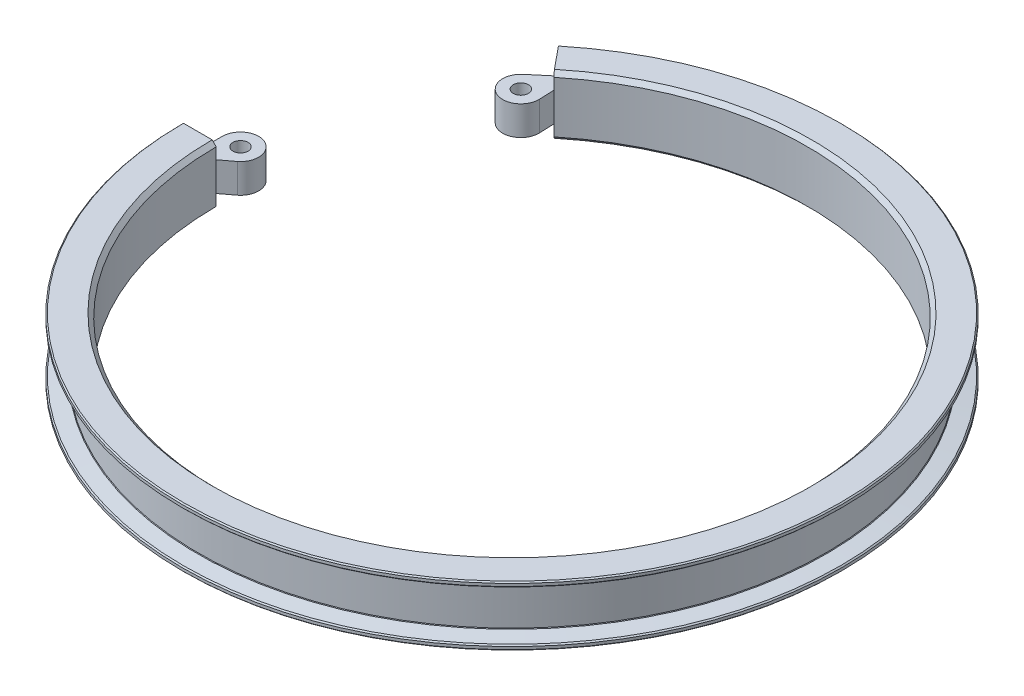
ISO-10303-21;
HEADER;
FILE_DESCRIPTION(('STEP AP214'),'2;1');
FILE_NAME('part.step','',(''),(''),'','','');
FILE_SCHEMA(('AUTOMOTIVE_DESIGN { 1 0 10303 214 1 1 1 1 }'));
ENDSEC;
DATA;
#1=APPLICATION_CONTEXT('core data for automotive mechanical design processes');
#2=APPLICATION_PROTOCOL_DEFINITION('international standard','automotive_design',2000,#1);
#3=PRODUCT_CONTEXT('',#1,'mechanical');
#4=PRODUCT('Part','Part','',(#3));
#5=PRODUCT_RELATED_PRODUCT_CATEGORY('part','',(#4));
#6=PRODUCT_DEFINITION_FORMATION('','',#4);
#7=PRODUCT_DEFINITION_CONTEXT('part definition',#1,'design');
#8=PRODUCT_DEFINITION('design','',#6,#7);
#9=PRODUCT_DEFINITION_SHAPE('','',#8);
#10=(LENGTH_UNIT() NAMED_UNIT(*) SI_UNIT(.MILLI.,.METRE.));
#11=(NAMED_UNIT(*) PLANE_ANGLE_UNIT() SI_UNIT($,.RADIAN.));
#12=(NAMED_UNIT(*) SI_UNIT($,.STERADIAN.) SOLID_ANGLE_UNIT());
#13=UNCERTAINTY_MEASURE_WITH_UNIT(LENGTH_MEASURE(1.E-05),#10,'distance_accuracy_value','');
#14=(GEOMETRIC_REPRESENTATION_CONTEXT(3) GLOBAL_UNCERTAINTY_ASSIGNED_CONTEXT((#13)) GLOBAL_UNIT_ASSIGNED_CONTEXT((#10,
#11,#12)) REPRESENTATION_CONTEXT('',''));
#15=CARTESIAN_POINT('',(0.,0.,0.));
#16=DIRECTION('',(0.,0.,1.));
#17=DIRECTION('',(1.,0.,0.));
#18=AXIS2_PLACEMENT_3D('',#15,#16,#17);
#19=CARTESIAN_POINT('',(0.,0.,0.));
#20=DIRECTION('',(0.,-1.,0.));
#21=DIRECTION('',(0.,0.,-1.));
#22=AXIS2_PLACEMENT_3D('',#19,#20,#21);
#23=CYLINDRICAL_SURFACE('',#22,64.262);
#24=CARTESIAN_POINT('',(0.,-3.175,0.));
#25=DIRECTION('',(0.,1.,0.));
#26=DIRECTION('',(0.,0.,1.));
#27=AXIS2_PLACEMENT_3D('',#24,#25,#26);
#28=CIRCLE('',#27,64.262);
#29=CARTESIAN_POINT('',(-40.667594664767,-3.175,-49.7569230176286));
#30=VERTEX_POINT('',#29);
#31=CARTESIAN_POINT('',(-40.6635868408749,-3.175,-49.760198444486));
#32=VERTEX_POINT('',#31);
#33=EDGE_CURVE('E237',#30,#32,#28,.F.);
#34=ORIENTED_EDGE('',*,*,#33,.F.);
#35=DIRECTION('',(0.,1.,0.));
#36=VECTOR('',#35,1.);
#37=CARTESIAN_POINT('',(-40.667594664767,5.60346378382917,-49.7569230176286));
#38=LINE('',#37,#36);
#39=CARTESIAN_POINT('',(-40.667594664767,-5.6034637838292,-49.7569230176286));
#40=VERTEX_POINT('',#39);
#41=EDGE_CURVE('E355',#40,#30,#38,.T.);
#42=ORIENTED_EDGE('',*,*,#41,.F.);
#43=CARTESIAN_POINT('',(0.,-5.6034637838292,0.));
#44=DIRECTION('',(0.,-1.,0.));
#45=DIRECTION('',(0.,0.,-1.));
#46=AXIS2_PLACEMENT_3D('',#43,#44,#45);
#47=CIRCLE('',#46,64.262);
#48=CARTESIAN_POINT('',(-64.262,-5.6034637838292,0.));
#49=VERTEX_POINT('',#48);
#50=EDGE_CURVE('E391',#40,#49,#47,.T.);
#51=ORIENTED_EDGE('',*,*,#50,.T.);
#52=DIRECTION('',(0.,1.,0.));
#53=VECTOR('',#52,1.);
#54=CARTESIAN_POINT('',(-64.262,5.60346378382917,0.));
#55=LINE('',#54,#53);
#56=CARTESIAN_POINT('',(-64.262,-3.175,0.));
#57=VERTEX_POINT('',#56);
#58=EDGE_CURVE('E306',#49,#57,#55,.T.);
#59=ORIENTED_EDGE('',*,*,#58,.T.);
#60=DIRECTION('',(0.,1.,0.));
#61=VECTOR('',#60,1.);
#62=CARTESIAN_POINT('',(-64.262,-3.175,0.));
#63=LINE('',#62,#61);
#64=CARTESIAN_POINT('',(-64.262,3.175,0.));
#65=VERTEX_POINT('',#64);
#66=EDGE_CURVE('E268',#57,#65,#63,.T.);
#67=ORIENTED_EDGE('',*,*,#66,.T.);
#68=CARTESIAN_POINT('',(-64.262,5.60346378382917,0.));
#69=VERTEX_POINT('',#68);
#70=EDGE_CURVE('E305',#65,#69,#55,.T.);
#71=ORIENTED_EDGE('',*,*,#70,.T.);
#72=CARTESIAN_POINT('',(0.,5.60346378382917,0.));
#73=DIRECTION('',(0.,-1.,0.));
#74=DIRECTION('',(0.,0.,-1.));
#75=AXIS2_PLACEMENT_3D('',#72,#73,#74);
#76=CIRCLE('',#75,64.262);
#77=CARTESIAN_POINT('',(-40.667594664767,5.60346378382917,-49.7569230176286));
#78=VERTEX_POINT('',#77);
#79=EDGE_CURVE('E388',#78,#69,#76,.T.);
#80=ORIENTED_EDGE('',*,*,#79,.F.);
#81=CARTESIAN_POINT('',(-40.667594664767,3.175,-49.7569230176286));
#82=VERTEX_POINT('',#81);
#83=EDGE_CURVE('E354',#82,#78,#38,.T.);
#84=ORIENTED_EDGE('',*,*,#83,.F.);
#85=CARTESIAN_POINT('',(0.,3.175,0.));
#86=DIRECTION('',(0.,1.,0.));
#87=DIRECTION('',(0.,0.,1.));
#88=AXIS2_PLACEMENT_3D('',#85,#86,#87);
#89=CIRCLE('',#88,64.262);
#90=CARTESIAN_POINT('',(-40.6635868408749,3.175,-49.760198444486));
#91=VERTEX_POINT('',#90);
#92=EDGE_CURVE('E52',#82,#91,#89,.F.);
#93=ORIENTED_EDGE('',*,*,#92,.T.);
#94=DIRECTION('',(0.,1.,0.));
#95=VECTOR('',#94,1.);
#96=CARTESIAN_POINT('',(-40.6635868408749,-3.175,-49.760198444486));
#97=LINE('',#96,#95);
#98=EDGE_CURVE('E47',#32,#91,#97,.T.);
#99=ORIENTED_EDGE('',*,*,#98,.F.);
#100=EDGE_LOOP('',(#34,#42,#51,#59,#67,#71,#80,#84,#93,#99));
#101=FACE_BOUND('',#100,.T.);
#102=ADVANCED_FACE('F32',(#101),#23,.F.);
#103=CARTESIAN_POINT('',(-43.2294649636545,4.60035370374329,-52.8913789473109));
#104=DIRECTION('',(-0.774282204376281,0.,0.632840475938611));
#105=DIRECTION('',(0.632840475938611,0.,0.774282204376281));
#106=AXIS2_PLACEMENT_3D('',#103,#104,#105);
#107=PLANE('',#106);
#108=ORIENTED_EDGE('',*,*,#41,.T.);
#109=DIRECTION('',(-0.632840475938611,0.,-0.774282204376281));
#110=VECTOR('',#109,1.);
#111=CARTESIAN_POINT('',(-43.2294649636545,-3.175,-52.8913789473109));
#112=LINE('',#111,#110);
#113=CARTESIAN_POINT('',(-43.0786661012368,-3.175,-52.7068760906674));
#114=VERTEX_POINT('',#113);
#115=EDGE_CURVE('E11',#30,#114,#112,.T.);
#116=ORIENTED_EDGE('',*,*,#115,.T.);
#117=DIRECTION('',(0.,-1.,0.));
#118=VECTOR('',#117,1.);
#119=CARTESIAN_POINT('',(-43.0786661012368,4.60035370374329,-52.7068760906674));
#120=LINE('',#119,#118);
#121=CARTESIAN_POINT('',(-43.0786661012368,3.175,-52.7068760906674));
#122=VERTEX_POINT('',#121);
#123=EDGE_CURVE('E40',#122,#114,#120,.T.);
#124=ORIENTED_EDGE('',*,*,#123,.F.);
#125=DIRECTION('',(-0.632840475938611,0.,-0.774282204376281));
#126=VECTOR('',#125,1.);
#127=CARTESIAN_POINT('',(-43.2294649636545,3.175,-52.8913789473109));
#128=LINE('',#127,#126);
#129=EDGE_CURVE('E410',#82,#122,#128,.T.);
#130=ORIENTED_EDGE('',*,*,#129,.F.);
#131=ORIENTED_EDGE('',*,*,#83,.T.);
#132=DIRECTION('',(-0.447485791945515,0.707106781186546,-0.547500197266538));
#133=VECTOR('',#132,1.);
#134=CARTESIAN_POINT('',(-41.2268272535047,6.48715028935531,-50.4411457531049));
#135=LINE('',#134,#133);
#136=CARTESIAN_POINT('',(-41.2268272535047,6.48715028935531,-50.4411457531049));
#137=VERTEX_POINT('',#136);
#138=EDGE_CURVE('E358',#78,#137,#135,.T.);
#139=ORIENTED_EDGE('',*,*,#138,.T.);
#140=DIRECTION('',(-0.632840475938611,0.,-0.774282204376281));
#141=VECTOR('',#140,1.);
#142=CARTESIAN_POINT('',(-45.1683561296424,6.48715028935531,-55.2636180551527));
#143=LINE('',#142,#141);
#144=CARTESIAN_POINT('',(-45.1683561296424,6.48715028935531,-55.2636180551527));
#145=VERTEX_POINT('',#144);
#146=EDGE_CURVE('E361',#137,#145,#143,.T.);
#147=ORIENTED_EDGE('',*,*,#146,.T.);
#148=DIRECTION('',(-0.447485791945518,-0.707106781186541,-0.547500197266541));
#149=VECTOR('',#148,1.);
#150=CARTESIAN_POINT('',(-45.3290976105308,6.23315028935531,-55.4602857350642));
#151=LINE('',#150,#149);
#152=CARTESIAN_POINT('',(-45.3290976105308,6.23315028935531,-55.4602857350642));
#153=VERTEX_POINT('',#152);
#154=EDGE_CURVE('E364',#145,#153,#151,.T.);
#155=ORIENTED_EDGE('',*,*,#154,.T.);
#156=DIRECTION('',(0.,-1.,0.));
#157=VECTOR('',#156,1.);
#158=CARTESIAN_POINT('',(-45.3290976105308,5.64222278957888,-55.4602857350642));
#159=LINE('',#158,#157);
#160=CARTESIAN_POINT('',(-45.3290976105308,5.64222278957888,-55.4602857350642));
#161=VERTEX_POINT('',#160);
#162=EDGE_CURVE('E367',#153,#161,#159,.T.);
#163=ORIENTED_EDGE('',*,*,#162,.T.);
#164=DIRECTION('',(0.447485791945518,-0.707106781186541,0.547500197266541));
#165=VECTOR('',#164,1.);
#166=CARTESIAN_POINT('',(-45.1683561296424,5.38822278957888,-55.2636180551527));
#167=LINE('',#166,#165);
#168=CARTESIAN_POINT('',(-45.1683561296424,5.38822278957888,-55.2636180551527));
#169=VERTEX_POINT('',#168);
#170=EDGE_CURVE('E370',#161,#169,#167,.T.);
#171=ORIENTED_EDGE('',*,*,#170,.T.);
#172=DIRECTION('',(0.623226207124281,-0.173648177666921,0.762519117889146));
#173=VECTOR('',#172,1.);
#174=CARTESIAN_POINT('',(-43.1505291566454,4.82599999999999,-52.7948007526804));
#175=LINE('',#174,#173);
#176=CARTESIAN_POINT('',(-43.1505291566454,4.82599999999999,-52.7948007526804));
#177=VERTEX_POINT('',#176);
#178=EDGE_CURVE('E373',#169,#177,#175,.T.);
#179=ORIENTED_EDGE('',*,*,#178,.T.);
#180=CARTESIAN_POINT('',(-43.2294649636545,4.60035370374329,-52.8913789473109));
#181=DIRECTION('',(0.774282204376281,0.,-0.632840475938611));
#182=DIRECTION('',(0.632840475938611,0.,0.774282204376281));
#183=AXIS2_PLACEMENT_3D('',#180,#181,#182);
#184=CIRCLE('',#183,0.257826415094774);
#185=CARTESIAN_POINT('',(-43.0787168780931,4.69899999999998,-52.7069382163022));
#186=VERTEX_POINT('',#185);
#187=EDGE_CURVE('E327',#177,#186,#184,.T.);
#188=ORIENTED_EDGE('',*,*,#187,.T.);
#189=DIRECTION('',(0.,-1.,0.));
#190=VECTOR('',#189,1.);
#191=CARTESIAN_POINT('',(-43.0787168780931,4.69899999999998,-52.7069382163022));
#192=LINE('',#191,#190);
#193=CARTESIAN_POINT('',(-43.0787168780931,-4.69900000000002,-52.7069382163022));
#194=VERTEX_POINT('',#193);
#195=EDGE_CURVE('E330',#186,#194,#192,.T.);
#196=ORIENTED_EDGE('',*,*,#195,.T.);
#197=CARTESIAN_POINT('',(-43.2294649636545,-4.6003537037433,-52.8913789473108));
#198=DIRECTION('',(0.774282204376281,0.,-0.632840475938611));
#199=DIRECTION('',(-0.632840475938611,0.,-0.774282204376281));
#200=AXIS2_PLACEMENT_3D('',#197,#198,#199);
#201=CIRCLE('',#200,0.257826415094761);
#202=CARTESIAN_POINT('',(-43.1505291566454,-4.82599999999999,-52.7948007526804));
#203=VERTEX_POINT('',#202);
#204=EDGE_CURVE('E333',#194,#203,#201,.T.);
#205=ORIENTED_EDGE('',*,*,#204,.T.);
#206=DIRECTION('',(-0.62322620712428,-0.173648177666924,-0.762519117889145));
#207=VECTOR('',#206,1.);
#208=CARTESIAN_POINT('',(-43.1505291566454,-4.82599999999999,-52.7948007526804));
#209=LINE('',#208,#207);
#210=CARTESIAN_POINT('',(-45.1683561296424,-5.38822278957889,-55.2636180551527));
#211=VERTEX_POINT('',#210);
#212=EDGE_CURVE('E336',#203,#211,#209,.T.);
#213=ORIENTED_EDGE('',*,*,#212,.T.);
#214=DIRECTION('',(-0.44748579194551,-0.707106781186554,-0.547500197266532));
#215=VECTOR('',#214,1.);
#216=CARTESIAN_POINT('',(-45.1683561296424,-5.38822278957889,-55.2636180551527));
#217=LINE('',#216,#215);
#218=CARTESIAN_POINT('',(-45.3290976105308,-5.64222278957891,-55.4602857350642));
#219=VERTEX_POINT('',#218);
#220=EDGE_CURVE('E339',#211,#219,#217,.T.);
#221=ORIENTED_EDGE('',*,*,#220,.T.);
#222=DIRECTION('',(0.,-1.,0.));
#223=VECTOR('',#222,1.);
#224=CARTESIAN_POINT('',(-45.3290976105308,-5.64222278957891,-55.4602857350642));
#225=LINE('',#224,#223);
#226=CARTESIAN_POINT('',(-45.3290976105308,-6.23315028935535,-55.4602857350642));
#227=VERTEX_POINT('',#226);
#228=EDGE_CURVE('E342',#219,#227,#225,.T.);
#229=ORIENTED_EDGE('',*,*,#228,.T.);
#230=DIRECTION('',(0.447485791945516,-0.707106781186544,0.547500197266539));
#231=VECTOR('',#230,1.);
#232=CARTESIAN_POINT('',(-45.3290976105308,-6.23315028935535,-55.4602857350642));
#233=LINE('',#232,#231);
#234=CARTESIAN_POINT('',(-45.1683561296424,-6.48715028935535,-55.2636180551527));
#235=VERTEX_POINT('',#234);
#236=EDGE_CURVE('E345',#227,#235,#233,.T.);
#237=ORIENTED_EDGE('',*,*,#236,.T.);
#238=DIRECTION('',(0.632840475938611,0.,0.774282204376281));
#239=VECTOR('',#238,1.);
#240=CARTESIAN_POINT('',(-45.1683561296424,-6.48715028935535,-55.2636180551527));
#241=LINE('',#240,#239);
#242=CARTESIAN_POINT('',(-41.2268272535047,-6.48715028935535,-50.4411457531049));
#243=VERTEX_POINT('',#242);
#244=EDGE_CURVE('E348',#235,#243,#241,.T.);
#245=ORIENTED_EDGE('',*,*,#244,.T.);
#246=DIRECTION('',(0.447485791945514,0.707106781186547,0.547500197266537));
#247=VECTOR('',#246,1.);
#248=CARTESIAN_POINT('',(-41.2268272535047,-6.48715028935535,-50.4411457531049));
#249=LINE('',#248,#247);
#250=EDGE_CURVE('E351',#243,#40,#249,.T.);
#251=ORIENTED_EDGE('',*,*,#250,.T.);
#252=EDGE_LOOP('',(#108,#116,#124,#130,#131,#139,#147,#155,#163,#171,#179,#188,#196,#205,#213,
#221,#229,#237,#245,#251));
#253=FACE_BOUND('',#252,.T.);
#254=ADVANCED_FACE('F420',(#253),#107,.T.);
#255=CARTESIAN_POINT('',(-68.3102086659957,4.60035370374329,0.));
#256=DIRECTION('',(0.,0.,1.));
#257=DIRECTION('',(1.,0.,0.));
#258=AXIS2_PLACEMENT_3D('',#255,#256,#257);
#259=PLANE('',#258);
#260=DIRECTION('',(1.,0.,0.));
#261=VECTOR('',#260,1.);
#262=CARTESIAN_POINT('',(-64.262,3.175,0.));
#263=LINE('',#262,#261);
#264=CARTESIAN_POINT('',(-68.072,3.175,0.));
#265=VERTEX_POINT('',#264);
#266=EDGE_CURVE('E242',#265,#65,#263,.T.);
#267=ORIENTED_EDGE('',*,*,#266,.F.);
#268=DIRECTION('',(0.,-1.,0.));
#269=VECTOR('',#268,1.);
#270=CARTESIAN_POINT('',(-68.072,4.69899999999998,0.));
#271=LINE('',#270,#269);
#272=CARTESIAN_POINT('',(-68.072,4.69899999999998,0.));
#273=VERTEX_POINT('',#272);
#274=EDGE_CURVE('E281',#273,#265,#271,.T.);
#275=ORIENTED_EDGE('',*,*,#274,.F.);
#276=CARTESIAN_POINT('',(-68.3102086659957,4.60035370374329,0.));
#277=DIRECTION('',(0.,0.,-1.));
#278=DIRECTION('',(1.,0.,0.));
#279=AXIS2_PLACEMENT_3D('',#276,#277,#278);
#280=CIRCLE('',#279,0.257826415094774);
#281=CARTESIAN_POINT('',(-68.1854761148863,4.82599999999999,0.));
#282=VERTEX_POINT('',#281);
#283=EDGE_CURVE('E272',#282,#273,#280,.T.);
#284=ORIENTED_EDGE('',*,*,#283,.F.);
#285=DIRECTION('',(0.98480775301221,-0.173648177666921,0.));
#286=VECTOR('',#285,1.);
#287=CARTESIAN_POINT('',(-68.1854761148863,4.82599999999999,0.));
#288=LINE('',#287,#286);
#289=CARTESIAN_POINT('',(-71.374,5.38822278957888,0.));
#290=VERTEX_POINT('',#289);
#291=EDGE_CURVE('E324',#290,#282,#288,.T.);
#292=ORIENTED_EDGE('',*,*,#291,.F.);
#293=DIRECTION('',(0.707106781186554,-0.707106781186541,0.));
#294=VECTOR('',#293,1.);
#295=CARTESIAN_POINT('',(-71.374,5.38822278957888,0.));
#296=LINE('',#295,#294);
#297=CARTESIAN_POINT('',(-71.628,5.64222278957888,0.));
#298=VERTEX_POINT('',#297);
#299=EDGE_CURVE('E321',#298,#290,#296,.T.);
#300=ORIENTED_EDGE('',*,*,#299,.F.);
#301=DIRECTION('',(0.,-1.,0.));
#302=VECTOR('',#301,1.);
#303=CARTESIAN_POINT('',(-71.628,5.64222278957888,0.));
#304=LINE('',#303,#302);
#305=CARTESIAN_POINT('',(-71.628,6.23315028935531,0.));
#306=VERTEX_POINT('',#305);
#307=EDGE_CURVE('E318',#306,#298,#304,.T.);
#308=ORIENTED_EDGE('',*,*,#307,.F.);
#309=DIRECTION('',(-0.707106781186554,-0.707106781186541,0.));
#310=VECTOR('',#309,1.);
#311=CARTESIAN_POINT('',(-71.628,6.23315028935531,0.));
#312=LINE('',#311,#310);
#313=CARTESIAN_POINT('',(-71.374,6.48715028935531,0.));
#314=VERTEX_POINT('',#313);
#315=EDGE_CURVE('E315',#314,#306,#312,.T.);
#316=ORIENTED_EDGE('',*,*,#315,.F.);
#317=DIRECTION('',(-1.,0.,0.));
#318=VECTOR('',#317,1.);
#319=CARTESIAN_POINT('',(-71.374,6.48715028935531,0.));
#320=LINE('',#319,#318);
#321=CARTESIAN_POINT('',(-65.1456865055261,6.48715028935531,0.));
#322=VERTEX_POINT('',#321);
#323=EDGE_CURVE('E312',#322,#314,#320,.T.);
#324=ORIENTED_EDGE('',*,*,#323,.F.);
#325=DIRECTION('',(-0.707106781186549,0.707106781186546,0.));
#326=VECTOR('',#325,1.);
#327=CARTESIAN_POINT('',(-65.1456865055261,6.48715028935531,0.));
#328=LINE('',#327,#326);
#329=EDGE_CURVE('E309',#69,#322,#328,.T.);
#330=ORIENTED_EDGE('',*,*,#329,.F.);
#331=ORIENTED_EDGE('',*,*,#70,.F.);
#332=EDGE_LOOP('',(#267,#275,#284,#292,#300,#308,#316,#324,#330,#331));
#333=FACE_BOUND('',#332,.T.);
#334=ADVANCED_FACE('F448',(#333),#259,.F.);
#335=CARTESIAN_POINT('',(0.,4.60035370374329,0.));
#336=DIRECTION('',(0.,-1.,0.));
#337=DIRECTION('',(0.,0.,-1.));
#338=AXIS2_PLACEMENT_3D('',#335,#336,#337);
#339=TOROIDAL_SURFACE('',#338,68.3102086659957,0.257826415094774);
#340=CARTESIAN_POINT('',(0.,4.69899999999998,0.));
#341=DIRECTION('',(0.,-1.,0.));
#342=DIRECTION('',(0.,0.,-1.));
#343=AXIS2_PLACEMENT_3D('',#340,#341,#342);
#344=CIRCLE('',#343,68.072);
#345=EDGE_CURVE('E408',#186,#273,#344,.T.);
#346=ORIENTED_EDGE('',*,*,#345,.F.);
#347=ORIENTED_EDGE('',*,*,#187,.F.);
#348=CARTESIAN_POINT('',(0.,4.82599999999999,0.));
#349=DIRECTION('',(0.,-1.,0.));
#350=DIRECTION('',(0.,0.,-1.));
#351=AXIS2_PLACEMENT_3D('',#348,#349,#350);
#352=CIRCLE('',#351,68.1854761148863);
#353=EDGE_CURVE('E376',#177,#282,#352,.T.);
#354=ORIENTED_EDGE('',*,*,#353,.T.);
#355=ORIENTED_EDGE('',*,*,#283,.T.);
#356=EDGE_LOOP('',(#346,#347,#354,#355));
#357=FACE_BOUND('',#356,.T.);
#358=ADVANCED_FACE('F504',(#357),#339,.F.);
#359=CARTESIAN_POINT('',(0.,0.,0.));
#360=DIRECTION('',(0.,-1.,0.));
#361=DIRECTION('',(0.,0.,-1.));
#362=AXIS2_PLACEMENT_3D('',#359,#360,#361);
#363=CYLINDRICAL_SURFACE('',#362,68.072);
#364=CARTESIAN_POINT('',(0.,-4.69900000000002,0.));
#365=DIRECTION('',(0.,-1.,0.));
#366=DIRECTION('',(0.,0.,-1.));
#367=AXIS2_PLACEMENT_3D('',#364,#365,#366);
#368=CIRCLE('',#367,68.072);
#369=CARTESIAN_POINT('',(-68.072,-4.69900000000002,0.));
#370=VERTEX_POINT('',#369);
#371=EDGE_CURVE('E405',#194,#370,#368,.T.);
#372=ORIENTED_EDGE('',*,*,#371,.F.);
#373=ORIENTED_EDGE('',*,*,#195,.F.);
#374=ORIENTED_EDGE('',*,*,#345,.T.);
#375=ORIENTED_EDGE('',*,*,#274,.T.);
#376=DIRECTION('',(0.,1.,0.));
#377=VECTOR('',#376,1.);
#378=CARTESIAN_POINT('',(-68.072,-3.175,0.));
#379=LINE('',#378,#377);
#380=CARTESIAN_POINT('',(-68.072,-3.175,0.));
#381=VERTEX_POINT('',#380);
#382=EDGE_CURVE('E269',#381,#265,#379,.T.);
#383=ORIENTED_EDGE('',*,*,#382,.F.);
#384=EDGE_CURVE('E280',#381,#370,#271,.T.);
#385=ORIENTED_EDGE('',*,*,#384,.T.);
#386=EDGE_LOOP('',(#372,#373,#374,#375,#383,#385));
#387=FACE_BOUND('',#386,.T.);
#388=ADVANCED_FACE('F34',(#387),#363,.T.);
#389=CARTESIAN_POINT('',(0.,-4.6003537037433,0.));
#390=DIRECTION('',(0.,-1.,0.));
#391=DIRECTION('',(0.,0.,-1.));
#392=AXIS2_PLACEMENT_3D('',#389,#390,#391);
#393=TOROIDAL_SURFACE('',#392,68.3102086659957,0.257826415094761);
#394=CARTESIAN_POINT('',(0.,-4.82599999999999,0.));
#395=DIRECTION('',(0.,-1.,0.));
#396=DIRECTION('',(0.,0.,-1.));
#397=AXIS2_PLACEMENT_3D('',#394,#395,#396);
#398=CIRCLE('',#397,68.1854761148863);
#399=CARTESIAN_POINT('',(-68.1854761148863,-4.82599999999999,0.));
#400=VERTEX_POINT('',#399);
#401=EDGE_CURVE('E403',#203,#400,#398,.T.);
#402=ORIENTED_EDGE('',*,*,#401,.F.);
#403=ORIENTED_EDGE('',*,*,#204,.F.);
#404=ORIENTED_EDGE('',*,*,#371,.T.);
#405=CARTESIAN_POINT('',(-68.3102086659957,-4.6003537037433,0.));
#406=DIRECTION('',(0.,0.,-1.));
#407=DIRECTION('',(-1.,0.,0.));
#408=AXIS2_PLACEMENT_3D('',#405,#406,#407);
#409=CIRCLE('',#408,0.257826415094761);
#410=EDGE_CURVE('E284',#370,#400,#409,.T.);
#411=ORIENTED_EDGE('',*,*,#410,.T.);
#412=EDGE_LOOP('',(#402,#403,#404,#411));
#413=FACE_BOUND('',#412,.T.);
#414=ADVANCED_FACE('F497',(#413),#393,.F.);
#415=CARTESIAN_POINT('',(0.,-4.82599999999999,0.));
#416=DIRECTION('',(0.,-1.,0.));
#417=DIRECTION('',(0.,0.,-1.));
#418=AXIS2_PLACEMENT_3D('',#415,#416,#417);
#419=CONICAL_SURFACE('',#418,68.1854761148863,1.39626340159547);
#420=CARTESIAN_POINT('',(0.,-5.38822278957889,0.));
#421=DIRECTION('',(0.,-1.,0.));
#422=DIRECTION('',(0.,0.,-1.));
#423=AXIS2_PLACEMENT_3D('',#420,#421,#422);
#424=CIRCLE('',#423,71.374);
#425=CARTESIAN_POINT('',(-71.374,-5.38822278957889,0.));
#426=VERTEX_POINT('',#425);
#427=EDGE_CURVE('E401',#211,#426,#424,.T.);
#428=ORIENTED_EDGE('',*,*,#427,.F.);
#429=ORIENTED_EDGE('',*,*,#212,.F.);
#430=ORIENTED_EDGE('',*,*,#401,.T.);
#431=DIRECTION('',(-0.984807753012209,-0.173648177666924,0.));
#432=VECTOR('',#431,1.);
#433=CARTESIAN_POINT('',(-68.1854761148863,-4.82599999999999,0.));
#434=LINE('',#433,#432);
#435=EDGE_CURVE('E287',#400,#426,#434,.T.);
#436=ORIENTED_EDGE('',*,*,#435,.T.);
#437=EDGE_LOOP('',(#428,#429,#430,#436));
#438=FACE_BOUND('',#437,.T.);
#439=ADVANCED_FACE('F494',(#438),#419,.T.);
#440=CARTESIAN_POINT('',(0.,-5.38822278957889,0.));
#441=DIRECTION('',(0.,-1.,0.));
#442=DIRECTION('',(0.,0.,-1.));
#443=AXIS2_PLACEMENT_3D('',#440,#441,#442);
#444=CONICAL_SURFACE('',#443,71.374,0.78539816339744);
#445=CARTESIAN_POINT('',(0.,-5.64222278957891,0.));
#446=DIRECTION('',(0.,-1.,0.));
#447=DIRECTION('',(0.,0.,-1.));
#448=AXIS2_PLACEMENT_3D('',#445,#446,#447);
#449=CIRCLE('',#448,71.628);
#450=CARTESIAN_POINT('',(-71.628,-5.64222278957891,0.));
#451=VERTEX_POINT('',#450);
#452=EDGE_CURVE('E399',#219,#451,#449,.T.);
#453=ORIENTED_EDGE('',*,*,#452,.F.);
#454=ORIENTED_EDGE('',*,*,#220,.F.);
#455=ORIENTED_EDGE('',*,*,#427,.T.);
#456=DIRECTION('',(-0.707106781186541,-0.707106781186554,0.));
#457=VECTOR('',#456,1.);
#458=CARTESIAN_POINT('',(-71.374,-5.38822278957889,0.));
#459=LINE('',#458,#457);
#460=EDGE_CURVE('E290',#426,#451,#459,.T.);
#461=ORIENTED_EDGE('',*,*,#460,.T.);
#462=EDGE_LOOP('',(#453,#454,#455,#461));
#463=FACE_BOUND('',#462,.T.);
#464=ADVANCED_FACE('F490',(#463),#444,.T.);
#465=CARTESIAN_POINT('',(0.,0.,0.));
#466=DIRECTION('',(0.,-1.,0.));
#467=DIRECTION('',(0.,0.,-1.));
#468=AXIS2_PLACEMENT_3D('',#465,#466,#467);
#469=CYLINDRICAL_SURFACE('',#468,71.628);
#470=CARTESIAN_POINT('',(0.,-6.23315028935535,0.));
#471=DIRECTION('',(0.,-1.,0.));
#472=DIRECTION('',(0.,0.,-1.));
#473=AXIS2_PLACEMENT_3D('',#470,#471,#472);
#474=CIRCLE('',#473,71.628);
#475=CARTESIAN_POINT('',(-71.628,-6.23315028935535,0.));
#476=VERTEX_POINT('',#475);
#477=EDGE_CURVE('E397',#227,#476,#474,.T.);
#478=ORIENTED_EDGE('',*,*,#477,.F.);
#479=ORIENTED_EDGE('',*,*,#228,.F.);
#480=ORIENTED_EDGE('',*,*,#452,.T.);
#481=DIRECTION('',(0.,-1.,0.));
#482=VECTOR('',#481,1.);
#483=CARTESIAN_POINT('',(-71.628,-5.64222278957891,0.));
#484=LINE('',#483,#482);
#485=EDGE_CURVE('E293',#451,#476,#484,.T.);
#486=ORIENTED_EDGE('',*,*,#485,.T.);
#487=EDGE_LOOP('',(#478,#479,#480,#486));
#488=FACE_BOUND('',#487,.T.);
#489=ADVANCED_FACE('F486',(#488),#469,.T.);
#490=CARTESIAN_POINT('',(0.,-6.23315028935535,0.));
#491=DIRECTION('',(0.,1.,0.));
#492=DIRECTION('',(0.,0.,1.));
#493=AXIS2_PLACEMENT_3D('',#490,#491,#492);
#494=CONICAL_SURFACE('',#493,71.628,0.785398163397453);
#495=CARTESIAN_POINT('',(0.,-6.48715028935535,0.));
#496=DIRECTION('',(0.,-1.,0.));
#497=DIRECTION('',(0.,0.,-1.));
#498=AXIS2_PLACEMENT_3D('',#495,#496,#497);
#499=CIRCLE('',#498,71.374);
#500=CARTESIAN_POINT('',(-71.374,-6.48715028935535,0.));
#501=VERTEX_POINT('',#500);
#502=EDGE_CURVE('E395',#235,#501,#499,.T.);
#503=ORIENTED_EDGE('',*,*,#502,.F.);
#504=ORIENTED_EDGE('',*,*,#236,.F.);
#505=ORIENTED_EDGE('',*,*,#477,.T.);
#506=DIRECTION('',(0.707106781186551,-0.707106781186544,0.));
#507=VECTOR('',#506,1.);
#508=CARTESIAN_POINT('',(-71.628,-6.23315028935535,0.));
#509=LINE('',#508,#507);
#510=EDGE_CURVE('E296',#476,#501,#509,.T.);
#511=ORIENTED_EDGE('',*,*,#510,.T.);
#512=EDGE_LOOP('',(#503,#504,#505,#511));
#513=FACE_BOUND('',#512,.T.);
#514=ADVANCED_FACE('F482',(#513),#494,.T.);
#515=CARTESIAN_POINT('',(-45.1683561296424,-6.48715028935535,-55.2636180551527));
#516=DIRECTION('',(0.,1.,0.));
#517=DIRECTION('',(0.,0.,1.));
#518=AXIS2_PLACEMENT_3D('',#515,#516,#517);
#519=PLANE('',#518);
#520=CARTESIAN_POINT('',(0.,-6.48715028935535,0.));
#521=DIRECTION('',(0.,-1.,0.));
#522=DIRECTION('',(0.,0.,-1.));
#523=AXIS2_PLACEMENT_3D('',#520,#521,#522);
#524=CIRCLE('',#523,65.1456865055261);
#525=CARTESIAN_POINT('',(-65.1456865055261,-6.48715028935535,0.));
#526=VERTEX_POINT('',#525);
#527=EDGE_CURVE('E393',#243,#526,#524,.T.);
#528=ORIENTED_EDGE('',*,*,#527,.F.);
#529=ORIENTED_EDGE('',*,*,#244,.F.);
#530=ORIENTED_EDGE('',*,*,#502,.T.);
#531=DIRECTION('',(1.,0.,0.));
#532=VECTOR('',#531,1.);
#533=CARTESIAN_POINT('',(-71.374,-6.48715028935535,0.));
#534=LINE('',#533,#532);
#535=EDGE_CURVE('E299',#501,#526,#534,.T.);
#536=ORIENTED_EDGE('',*,*,#535,.T.);
#537=EDGE_LOOP('',(#528,#529,#530,#536));
#538=FACE_BOUND('',#537,.T.);
#539=ADVANCED_FACE('F479',(#538),#519,.F.);
#540=CARTESIAN_POINT('',(0.,-6.48715028935535,0.));
#541=DIRECTION('',(0.,-1.,0.));
#542=DIRECTION('',(0.,0.,-1.));
#543=AXIS2_PLACEMENT_3D('',#540,#541,#542);
#544=CONICAL_SURFACE('',#543,65.1456865055261,0.785398163397449);
#545=ORIENTED_EDGE('',*,*,#50,.F.);
#546=ORIENTED_EDGE('',*,*,#250,.F.);
#547=ORIENTED_EDGE('',*,*,#527,.T.);
#548=DIRECTION('',(0.707106781186548,0.707106781186547,0.));
#549=VECTOR('',#548,1.);
#550=CARTESIAN_POINT('',(-65.1456865055261,-6.48715028935535,0.));
#551=LINE('',#550,#549);
#552=EDGE_CURVE('E302',#526,#49,#551,.T.);
#553=ORIENTED_EDGE('',*,*,#552,.T.);
#554=EDGE_LOOP('',(#545,#546,#547,#553));
#555=FACE_BOUND('',#554,.T.);
#556=ADVANCED_FACE('F424',(#555),#544,.F.);
#557=CARTESIAN_POINT('',(0.,5.60346378382917,0.));
#558=DIRECTION('',(0.,1.,0.));
#559=DIRECTION('',(0.,0.,1.));
#560=AXIS2_PLACEMENT_3D('',#557,#558,#559);
#561=CONICAL_SURFACE('',#560,64.262,0.78539816339745);
#562=CARTESIAN_POINT('',(0.,6.48715028935531,0.));
#563=DIRECTION('',(0.,-1.,0.));
#564=DIRECTION('',(0.,0.,-1.));
#565=AXIS2_PLACEMENT_3D('',#562,#563,#564);
#566=CIRCLE('',#565,65.1456865055261);
#567=EDGE_CURVE('E386',#137,#322,#566,.T.);
#568=ORIENTED_EDGE('',*,*,#567,.F.);
#569=ORIENTED_EDGE('',*,*,#138,.F.);
#570=ORIENTED_EDGE('',*,*,#79,.T.);
#571=ORIENTED_EDGE('',*,*,#329,.T.);
#572=EDGE_LOOP('',(#568,#569,#570,#571));
#573=FACE_BOUND('',#572,.T.);
#574=ADVANCED_FACE('F475',(#573),#561,.F.);
#575=CARTESIAN_POINT('',(-45.1683561296424,6.48715028935531,-55.2636180551527));
#576=DIRECTION('',(0.,-1.,0.));
#577=DIRECTION('',(0.,0.,-1.));
#578=AXIS2_PLACEMENT_3D('',#575,#576,#577);
#579=PLANE('',#578);
#580=CARTESIAN_POINT('',(0.,6.48715028935531,0.));
#581=DIRECTION('',(0.,-1.,0.));
#582=DIRECTION('',(0.,0.,-1.));
#583=AXIS2_PLACEMENT_3D('',#580,#581,#582);
#584=CIRCLE('',#583,71.374);
#585=EDGE_CURVE('E384',#145,#314,#584,.T.);
#586=ORIENTED_EDGE('',*,*,#585,.F.);
#587=ORIENTED_EDGE('',*,*,#146,.F.);
#588=ORIENTED_EDGE('',*,*,#567,.T.);
#589=ORIENTED_EDGE('',*,*,#323,.T.);
#590=EDGE_LOOP('',(#586,#587,#588,#589));
#591=FACE_BOUND('',#590,.T.);
#592=ADVANCED_FACE('F536',(#591),#579,.F.);
#593=CARTESIAN_POINT('',(0.,6.48715028935531,0.));
#594=DIRECTION('',(0.,-1.,0.));
#595=DIRECTION('',(0.,0.,-1.));
#596=AXIS2_PLACEMENT_3D('',#593,#594,#595);
#597=CONICAL_SURFACE('',#596,71.374,0.785398163397457);
#598=CARTESIAN_POINT('',(0.,6.23315028935531,0.));
#599=DIRECTION('',(0.,-1.,0.));
#600=DIRECTION('',(0.,0.,-1.));
#601=AXIS2_PLACEMENT_3D('',#598,#599,#600);
#602=CIRCLE('',#601,71.628);
#603=EDGE_CURVE('E382',#153,#306,#602,.T.);
#604=ORIENTED_EDGE('',*,*,#603,.F.);
#605=ORIENTED_EDGE('',*,*,#154,.F.);
#606=ORIENTED_EDGE('',*,*,#585,.T.);
#607=ORIENTED_EDGE('',*,*,#315,.T.);
#608=EDGE_LOOP('',(#604,#605,#606,#607));
#609=FACE_BOUND('',#608,.T.);
#610=ADVANCED_FACE('F533',(#609),#597,.T.);
#611=CARTESIAN_POINT('',(0.,0.,0.));
#612=DIRECTION('',(0.,-1.,0.));
#613=DIRECTION('',(0.,0.,-1.));
#614=AXIS2_PLACEMENT_3D('',#611,#612,#613);
#615=CYLINDRICAL_SURFACE('',#614,71.628);
#616=CARTESIAN_POINT('',(0.,5.64222278957888,0.));
#617=DIRECTION('',(0.,-1.,0.));
#618=DIRECTION('',(0.,0.,-1.));
#619=AXIS2_PLACEMENT_3D('',#616,#617,#618);
#620=CIRCLE('',#619,71.628);
#621=EDGE_CURVE('E380',#161,#298,#620,.T.);
#622=ORIENTED_EDGE('',*,*,#621,.F.);
#623=ORIENTED_EDGE('',*,*,#162,.F.);
#624=ORIENTED_EDGE('',*,*,#603,.T.);
#625=ORIENTED_EDGE('',*,*,#307,.T.);
#626=EDGE_LOOP('',(#622,#623,#624,#625));
#627=FACE_BOUND('',#626,.T.);
#628=ADVANCED_FACE('F529',(#627),#615,.T.);
#629=CARTESIAN_POINT('',(0.,5.64222278957888,0.));
#630=DIRECTION('',(0.,1.,0.));
#631=DIRECTION('',(0.,0.,1.));
#632=AXIS2_PLACEMENT_3D('',#629,#630,#631);
#633=CONICAL_SURFACE('',#632,71.628,0.785398163397457);
#634=CARTESIAN_POINT('',(0.,5.38822278957888,0.));
#635=DIRECTION('',(0.,-1.,0.));
#636=DIRECTION('',(0.,0.,-1.));
#637=AXIS2_PLACEMENT_3D('',#634,#635,#636);
#638=CIRCLE('',#637,71.374);
#639=EDGE_CURVE('E378',#169,#290,#638,.T.);
#640=ORIENTED_EDGE('',*,*,#639,.F.);
#641=ORIENTED_EDGE('',*,*,#170,.F.);
#642=ORIENTED_EDGE('',*,*,#621,.T.);
#643=ORIENTED_EDGE('',*,*,#299,.T.);
#644=EDGE_LOOP('',(#640,#641,#642,#643));
#645=FACE_BOUND('',#644,.T.);
#646=ADVANCED_FACE('F524',(#645),#633,.T.);
#647=CARTESIAN_POINT('',(0.,5.38822278957888,0.));
#648=DIRECTION('',(0.,1.,0.));
#649=DIRECTION('',(0.,0.,1.));
#650=AXIS2_PLACEMENT_3D('',#647,#648,#649);
#651=CONICAL_SURFACE('',#650,71.374,1.39626340159547);
#652=ORIENTED_EDGE('',*,*,#178,.F.);
#653=ORIENTED_EDGE('',*,*,#639,.T.);
#654=ORIENTED_EDGE('',*,*,#291,.T.);
#655=ORIENTED_EDGE('',*,*,#353,.F.);
#656=EDGE_LOOP('',(#652,#653,#654,#655));
#657=FACE_BOUND('',#656,.T.);
#658=ADVANCED_FACE('F464',(#657),#651,.T.);
#659=ORIENTED_EDGE('',*,*,#384,.F.);
#660=DIRECTION('',(1.,0.,0.));
#661=VECTOR('',#660,1.);
#662=CARTESIAN_POINT('',(-64.262,-3.175,0.));
#663=LINE('',#662,#661);
#664=EDGE_CURVE('E257',#381,#57,#663,.T.);
#665=ORIENTED_EDGE('',*,*,#664,.T.);
#666=ORIENTED_EDGE('',*,*,#58,.F.);
#667=ORIENTED_EDGE('',*,*,#552,.F.);
#668=ORIENTED_EDGE('',*,*,#535,.F.);
#669=ORIENTED_EDGE('',*,*,#510,.F.);
#670=ORIENTED_EDGE('',*,*,#485,.F.);
#671=ORIENTED_EDGE('',*,*,#460,.F.);
#672=ORIENTED_EDGE('',*,*,#435,.F.);
#673=ORIENTED_EDGE('',*,*,#410,.F.);
#674=EDGE_LOOP('',(#659,#665,#666,#667,#668,#669,#670,#671,#672,#673));
#675=FACE_BOUND('',#674,.T.);
#676=ADVANCED_FACE('F457',(#675),#259,.F.);
#677=CARTESIAN_POINT('',(-68.072,-3.175,0.));
#678=DIRECTION('',(-0.99989235039756,0.,-0.0146726826600587));
#679=DIRECTION('',(-0.0146726826600587,0.,0.99989235039756));
#680=AXIS2_PLACEMENT_3D('',#677,#678,#679);
#681=PLANE('',#680);
#682=ORIENTED_EDGE('',*,*,#382,.T.);
#683=DIRECTION('',(-0.0146726826600587,0.,0.99989235039756));
#684=VECTOR('',#683,1.);
#685=CARTESIAN_POINT('',(-68.072,3.175,0.));
#686=LINE('',#685,#684);
#687=CARTESIAN_POINT('',(-67.9978172906738,3.175,-5.05529392991885));
#688=VERTEX_POINT('',#687);
#689=EDGE_CURVE('E251',#688,#265,#686,.T.);
#690=ORIENTED_EDGE('',*,*,#689,.F.);
#691=DIRECTION('',(0.,1.,0.));
#692=VECTOR('',#691,1.);
#693=CARTESIAN_POINT('',(-67.9978172906738,-3.175,-5.05529392991885));
#694=LINE('',#693,#692);
#695=CARTESIAN_POINT('',(-67.9978172906738,-3.175,-5.05529392991885));
#696=VERTEX_POINT('',#695);
#697=EDGE_CURVE('E273',#696,#688,#694,.T.);
#698=ORIENTED_EDGE('',*,*,#697,.F.);
#699=DIRECTION('',(-0.0146726826600587,0.,0.99989235039756));
#700=VECTOR('',#699,1.);
#701=CARTESIAN_POINT('',(-68.072,-3.175,0.));
#702=LINE('',#701,#700);
#703=EDGE_CURVE('E265',#696,#381,#702,.T.);
#704=ORIENTED_EDGE('',*,*,#703,.T.);
#705=EDGE_LOOP('',(#682,#690,#698,#704));
#706=FACE_BOUND('',#705,.T.);
#707=ADVANCED_FACE('F455',(#706),#681,.T.);
#708=CARTESIAN_POINT('',(-64.0608948111092,-3.175,-5.07999999999999));
#709=DIRECTION('',(0.,1.,0.));
#710=DIRECTION('',(0.,0.,1.));
#711=AXIS2_PLACEMENT_3D('',#708,#709,#710);
#712=CYLINDRICAL_SURFACE('',#711,3.93699999999999);
#713=ORIENTED_EDGE('',*,*,#697,.T.);
#714=CARTESIAN_POINT('',(-64.0608948111092,3.175,-5.07999999999999));
#715=DIRECTION('',(0.,1.,0.));
#716=DIRECTION('',(0.,0.,-1.));
#717=AXIS2_PLACEMENT_3D('',#714,#715,#716);
#718=CIRCLE('',#717,3.93699999999999);
#719=CARTESIAN_POINT('',(-61.6340999600167,3.175,-1.97989746125857));
#720=VERTEX_POINT('',#719);
#721=EDGE_CURVE('E248',#720,#688,#718,.T.);
#722=ORIENTED_EDGE('',*,*,#721,.F.);
#723=DIRECTION('',(0.,1.,0.));
#724=VECTOR('',#723,1.);
#725=CARTESIAN_POINT('',(-61.6340999600167,-3.175,-1.97989746125857));
#726=LINE('',#725,#724);
#727=CARTESIAN_POINT('',(-61.6340999600167,-3.175,-1.97989746125857));
#728=VERTEX_POINT('',#727);
#729=EDGE_CURVE('E275',#728,#720,#726,.T.);
#730=ORIENTED_EDGE('',*,*,#729,.F.);
#731=CARTESIAN_POINT('',(-64.0608948111092,-3.175,-5.07999999999999));
#732=DIRECTION('',(0.,1.,0.));
#733=DIRECTION('',(0.,0.,-1.));
#734=AXIS2_PLACEMENT_3D('',#731,#732,#733);
#735=CIRCLE('',#734,3.93699999999999);
#736=EDGE_CURVE('E262',#728,#696,#735,.T.);
#737=ORIENTED_EDGE('',*,*,#736,.T.);
#738=EDGE_LOOP('',(#713,#722,#730,#737));
#739=FACE_BOUND('',#738,.T.);
#740=ADVANCED_FACE('F440',(#739),#712,.T.);
#741=CARTESIAN_POINT('',(-61.6340999600167,-3.175,-1.97989746125856));
#742=DIRECTION('',(0.60174382790386,0.,0.798689154539868));
#743=DIRECTION('',(0.798689154539869,0.,-0.60174382790386));
#744=AXIS2_PLACEMENT_3D('',#741,#742,#743);
#745=PLANE('',#744);
#746=ORIENTED_EDGE('',*,*,#729,.T.);
#747=DIRECTION('',(0.798689154539868,0.,-0.60174382790386));
#748=VECTOR('',#747,1.);
#749=CARTESIAN_POINT('',(-61.6340999600167,3.175,-1.97989746125856));
#750=LINE('',#749,#748);
#751=EDGE_CURVE('E245',#65,#720,#750,.T.);
#752=ORIENTED_EDGE('',*,*,#751,.F.);
#753=ORIENTED_EDGE('',*,*,#66,.F.);
#754=DIRECTION('',(0.798689154539868,0.,-0.60174382790386));
#755=VECTOR('',#754,1.);
#756=CARTESIAN_POINT('',(-61.6340999600167,-3.175,-1.97989746125856));
#757=LINE('',#756,#755);
#758=EDGE_CURVE('E259',#57,#728,#757,.T.);
#759=ORIENTED_EDGE('',*,*,#758,.T.);
#760=EDGE_LOOP('',(#746,#752,#753,#759));
#761=FACE_BOUND('',#760,.T.);
#762=ADVANCED_FACE('F433',(#761),#745,.T.);
#763=CARTESIAN_POINT('',(-64.0608948111092,-3.175,-5.07999999999999));
#764=DIRECTION('',(0.,-1.,0.));
#765=DIRECTION('',(0.,0.,-1.));
#766=AXIS2_PLACEMENT_3D('',#763,#764,#765);
#767=PLANE('',#766);
#768=CARTESIAN_POINT('',(-64.0608948111092,-3.175,-5.07999999999999));
#769=DIRECTION('',(0.,1.,0.));
#770=DIRECTION('',(0.,0.,1.));
#771=AXIS2_PLACEMENT_3D('',#768,#769,#770);
#772=CIRCLE('',#771,1.651);
#773=CARTESIAN_POINT('',(-64.0608948111092,-3.175,-3.42899999999999));
#774=VERTEX_POINT('',#773);
#775=EDGE_CURVE('E254',#774,#774,#772,.T.);
#776=ORIENTED_EDGE('',*,*,#775,.T.);
#777=EDGE_LOOP('',(#776));
#778=FACE_BOUND('',#777,.T.);
#779=ORIENTED_EDGE('',*,*,#664,.F.);
#780=ORIENTED_EDGE('',*,*,#703,.F.);
#781=ORIENTED_EDGE('',*,*,#736,.F.);
#782=ORIENTED_EDGE('',*,*,#758,.F.);
#783=EDGE_LOOP('',(#779,#780,#781,#782));
#784=FACE_BOUND('',#783,.T.);
#785=ADVANCED_FACE('F437',(#778,#784),#767,.T.);
#786=CARTESIAN_POINT('',(-64.0608948111092,-3.175,-5.07999999999999));
#787=DIRECTION('',(0.,1.,0.));
#788=DIRECTION('',(0.,0.,1.));
#789=AXIS2_PLACEMENT_3D('',#786,#787,#788);
#790=CYLINDRICAL_SURFACE('',#789,1.651);
#791=ORIENTED_EDGE('',*,*,#775,.F.);
#792=EDGE_LOOP('',(#791));
#793=FACE_BOUND('',#792,.T.);
#794=CARTESIAN_POINT('',(-64.0608948111092,3.175,-5.07999999999999));
#795=DIRECTION('',(0.,1.,0.));
#796=DIRECTION('',(0.,0.,1.));
#797=AXIS2_PLACEMENT_3D('',#794,#795,#796);
#798=CIRCLE('',#797,1.651);
#799=CARTESIAN_POINT('',(-64.0608948111092,3.175,-3.42899999999999));
#800=VERTEX_POINT('',#799);
#801=EDGE_CURVE('E239',#800,#800,#798,.T.);
#802=ORIENTED_EDGE('',*,*,#801,.T.);
#803=EDGE_LOOP('',(#802));
#804=FACE_BOUND('',#803,.T.);
#805=ADVANCED_FACE('F561',(#793,#804),#790,.F.);
#806=CARTESIAN_POINT('',(-64.0608948111092,3.175,-5.07999999999999));
#807=DIRECTION('',(0.,-1.,0.));
#808=DIRECTION('',(0.,0.,-1.));
#809=AXIS2_PLACEMENT_3D('',#806,#807,#808);
#810=PLANE('',#809);
#811=ORIENTED_EDGE('',*,*,#266,.T.);
#812=ORIENTED_EDGE('',*,*,#751,.T.);
#813=ORIENTED_EDGE('',*,*,#721,.T.);
#814=ORIENTED_EDGE('',*,*,#689,.T.);
#815=EDGE_LOOP('',(#811,#812,#813,#814));
#816=FACE_BOUND('',#815,.T.);
#817=ORIENTED_EDGE('',*,*,#801,.F.);
#818=EDGE_LOOP('',(#817));
#819=FACE_BOUND('',#818,.T.);
#820=ADVANCED_FACE('F443',(#816,#819),#810,.F.);
#821=CARTESIAN_POINT('',(-44.4699444049933,-3.175,-46.3899632314664));
#822=DIRECTION('',(0.,1.,0.));
#823=DIRECTION('',(0.,0.,1.));
#824=AXIS2_PLACEMENT_3D('',#821,#822,#823);
#825=PLANE('',#824);
#826=CARTESIAN_POINT('',(-44.4699444049933,-3.175,-46.3899632314664));
#827=DIRECTION('',(0.,1.,0.));
#828=DIRECTION('',(0.,0.,-1.));
#829=AXIS2_PLACEMENT_3D('',#826,#827,#828);
#830=CIRCLE('',#829,1.65100000000001);
#831=CARTESIAN_POINT('',(-44.4699444049933,-3.175,-48.0409632314664));
#832=VERTEX_POINT('',#831);
#833=EDGE_CURVE('E226',#832,#832,#830,.T.);
#834=ORIENTED_EDGE('',*,*,#833,.T.);
#835=EDGE_LOOP('',(#834));
#836=FACE_BOUND('',#835,.T.);
#837=ORIENTED_EDGE('',*,*,#115,.F.);
#838=ORIENTED_EDGE('',*,*,#33,.T.);
#839=DIRECTION('',(-0.0394428045385485,0.,-0.999221829810645));
#840=VECTOR('',#839,1.);
#841=CARTESIAN_POINT('',(-40.5338095088118,-3.175,-46.4724924933212));
#842=LINE('',#841,#840);
#843=CARTESIAN_POINT('',(-40.5338095088118,-3.175,-46.4724924933212));
#844=VERTEX_POINT('',#843);
#845=EDGE_CURVE('E230',#844,#32,#842,.T.);
#846=ORIENTED_EDGE('',*,*,#845,.F.);
#847=CARTESIAN_POINT('',(-44.4699444049933,-3.175,-46.3899632314664));
#848=DIRECTION('',(0.,1.,0.));
#849=DIRECTION('',(0.,0.,1.));
#850=AXIS2_PLACEMENT_3D('',#847,#848,#849);
#851=CIRCLE('',#850,3.93699999999999);
#852=CARTESIAN_POINT('',(-46.9420120372417,-3.175,-49.4540863722017));
#853=VERTEX_POINT('',#852);
#854=EDGE_CURVE('E204',#853,#844,#851,.T.);
#855=ORIENTED_EDGE('',*,*,#854,.F.);
#856=DIRECTION('',(-0.764965265216928,0.,0.644071535632181));
#857=VECTOR('',#856,1.);
#858=CARTESIAN_POINT('',(-43.0744714361837,-3.175,-52.7104078384278));
#859=LINE('',#858,#857);
#860=EDGE_CURVE('E208',#114,#853,#859,.T.);
#861=ORIENTED_EDGE('',*,*,#860,.F.);
#862=EDGE_LOOP('',(#837,#838,#846,#855,#861));
#863=FACE_BOUND('',#862,.T.);
#864=ADVANCED_FACE('F418',(#836,#863),#825,.F.);
#865=CARTESIAN_POINT('',(-44.4699444049933,3.175,-46.3899632314664));
#866=DIRECTION('',(0.,1.,0.));
#867=DIRECTION('',(0.,0.,1.));
#868=AXIS2_PLACEMENT_3D('',#865,#866,#867);
#869=PLANE('',#868);
#870=CARTESIAN_POINT('',(-44.4699444049933,3.175,-46.3899632314664));
#871=DIRECTION('',(0.,1.,0.));
#872=DIRECTION('',(0.,0.,-1.));
#873=AXIS2_PLACEMENT_3D('',#870,#871,#872);
#874=CIRCLE('',#873,1.65100000000001);
#875=CARTESIAN_POINT('',(-44.4699444049933,3.175,-48.0409632314664));
#876=VERTEX_POINT('',#875);
#877=EDGE_CURVE('E220',#876,#876,#874,.T.);
#878=ORIENTED_EDGE('',*,*,#877,.F.);
#879=EDGE_LOOP('',(#878));
#880=FACE_BOUND('',#879,.T.);
#881=ORIENTED_EDGE('',*,*,#92,.F.);
#882=ORIENTED_EDGE('',*,*,#129,.T.);
#883=DIRECTION('',(-0.764965265216928,0.,0.644071535632181));
#884=VECTOR('',#883,1.);
#885=CARTESIAN_POINT('',(-43.0744714361837,3.175,-52.7104078384278));
#886=LINE('',#885,#884);
#887=CARTESIAN_POINT('',(-46.9420120372417,3.175,-49.4540863722017));
#888=VERTEX_POINT('',#887);
#889=EDGE_CURVE('E214',#122,#888,#886,.T.);
#890=ORIENTED_EDGE('',*,*,#889,.T.);
#891=CARTESIAN_POINT('',(-44.4699444049933,3.175,-46.3899632314664));
#892=DIRECTION('',(0.,1.,0.));
#893=DIRECTION('',(0.,0.,1.));
#894=AXIS2_PLACEMENT_3D('',#891,#892,#893);
#895=CIRCLE('',#894,3.93699999999999);
#896=CARTESIAN_POINT('',(-40.5338095088118,3.175,-46.4724924933212));
#897=VERTEX_POINT('',#896);
#898=EDGE_CURVE('E202',#888,#897,#895,.T.);
#899=ORIENTED_EDGE('',*,*,#898,.T.);
#900=DIRECTION('',(-0.0394428045385485,0.,-0.999221829810645));
#901=VECTOR('',#900,1.);
#902=CARTESIAN_POINT('',(-40.5338095088118,3.175,-46.4724924933212));
#903=LINE('',#902,#901);
#904=EDGE_CURVE('E211',#897,#91,#903,.T.);
#905=ORIENTED_EDGE('',*,*,#904,.T.);
#906=EDGE_LOOP('',(#881,#882,#890,#899,#905));
#907=FACE_BOUND('',#906,.T.);
#908=ADVANCED_FACE('F216',(#880,#907),#869,.T.);
#909=CARTESIAN_POINT('',(-44.4699444049933,-3.175,-46.3899632314664));
#910=DIRECTION('',(0.,1.,0.));
#911=DIRECTION('',(0.,0.,1.));
#912=AXIS2_PLACEMENT_3D('',#909,#910,#911);
#913=CYLINDRICAL_SURFACE('',#912,3.93699999999999);
#914=DIRECTION('',(0.,1.,0.));
#915=VECTOR('',#914,1.);
#916=CARTESIAN_POINT('',(-40.5338095088118,-3.175,-46.4724924933212));
#917=LINE('',#916,#915);
#918=EDGE_CURVE('E197',#844,#897,#917,.T.);
#919=ORIENTED_EDGE('',*,*,#918,.T.);
#920=ORIENTED_EDGE('',*,*,#898,.F.);
#921=DIRECTION('',(0.,1.,0.));
#922=VECTOR('',#921,1.);
#923=CARTESIAN_POINT('',(-46.9420120372417,-3.175,-49.4540863722017));
#924=LINE('',#923,#922);
#925=EDGE_CURVE('E233',#853,#888,#924,.T.);
#926=ORIENTED_EDGE('',*,*,#925,.F.);
#927=ORIENTED_EDGE('',*,*,#854,.T.);
#928=EDGE_LOOP('',(#919,#920,#926,#927));
#929=FACE_BOUND('',#928,.T.);
#930=ADVANCED_FACE('F199',(#929),#913,.T.);
#931=CARTESIAN_POINT('',(-43.0744714361837,-3.175,-52.7104078384278));
#932=DIRECTION('',(-0.644071535632181,0.,-0.764965265216928));
#933=DIRECTION('',(-0.764965265216928,0.,0.644071535632181));
#934=AXIS2_PLACEMENT_3D('',#931,#932,#933);
#935=PLANE('',#934);
#936=ORIENTED_EDGE('',*,*,#889,.F.);
#937=ORIENTED_EDGE('',*,*,#123,.T.);
#938=ORIENTED_EDGE('',*,*,#860,.T.);
#939=ORIENTED_EDGE('',*,*,#925,.T.);
#940=EDGE_LOOP('',(#936,#937,#938,#939));
#941=FACE_BOUND('',#940,.T.);
#942=ADVANCED_FACE('F414',(#941),#935,.T.);
#943=CARTESIAN_POINT('',(-40.5338095088118,-3.175,-46.4724924933212));
#944=DIRECTION('',(0.999221829810645,0.,-0.0394428045385485));
#945=DIRECTION('',(-0.0394428045385485,0.,-0.999221829810645));
#946=AXIS2_PLACEMENT_3D('',#943,#944,#945);
#947=PLANE('',#946);
#948=ORIENTED_EDGE('',*,*,#98,.T.);
#949=ORIENTED_EDGE('',*,*,#904,.F.);
#950=ORIENTED_EDGE('',*,*,#918,.F.);
#951=ORIENTED_EDGE('',*,*,#845,.T.);
#952=EDGE_LOOP('',(#948,#949,#950,#951));
#953=FACE_BOUND('',#952,.T.);
#954=ADVANCED_FACE('F212',(#953),#947,.T.);
#955=CARTESIAN_POINT('',(-44.4699444049933,-3.175,-46.3899632314664));
#956=DIRECTION('',(0.,1.,0.));
#957=DIRECTION('',(0.,0.,1.));
#958=AXIS2_PLACEMENT_3D('',#955,#956,#957);
#959=CYLINDRICAL_SURFACE('',#958,1.65100000000001);
#960=ORIENTED_EDGE('',*,*,#833,.F.);
#961=EDGE_LOOP('',(#960));
#962=FACE_BOUND('',#961,.T.);
#963=ORIENTED_EDGE('',*,*,#877,.T.);
#964=EDGE_LOOP('',(#963));
#965=FACE_BOUND('',#964,.T.);
#966=ADVANCED_FACE('F575',(#962,#965),#959,.F.);
#967=CLOSED_SHELL('',(#102,#254,#334,#358,#388,#414,#439,#464,#489,#514,#539,#556,#574,#592,
#610,#628,#646,#658,#676,#707,#740,#762,#785,#805,#820,#864,#908,#930,#942,#954,#966));
#968=MANIFOLD_SOLID_BREP('B2',#967);
#969=ADVANCED_BREP_SHAPE_REPRESENTATION('',(#18,#968),#14);
#970=SHAPE_DEFINITION_REPRESENTATION(#9,#969);
ENDSEC;
END-ISO-10303-21;
